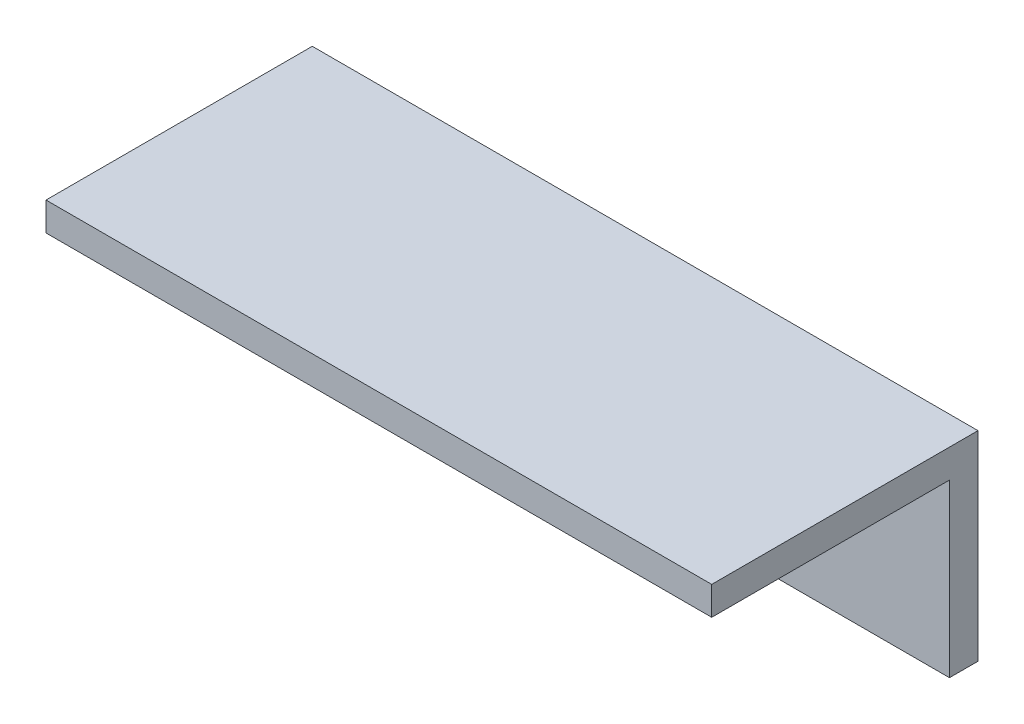
ISO-10303-21;
HEADER;
FILE_DESCRIPTION(('STEP AP214'),'2;1');
FILE_NAME('part.step','',(''),(''),'','','');
FILE_SCHEMA(('AUTOMOTIVE_DESIGN { 1 0 10303 214 1 1 1 1 }'));
ENDSEC;
DATA;
#1=APPLICATION_CONTEXT('core data for automotive mechanical design processes');
#2=APPLICATION_PROTOCOL_DEFINITION('international standard','automotive_design',2000,#1);
#3=PRODUCT_CONTEXT('',#1,'mechanical');
#4=PRODUCT('Part','Part','',(#3));
#5=PRODUCT_RELATED_PRODUCT_CATEGORY('part','',(#4));
#6=PRODUCT_DEFINITION_FORMATION('','',#4);
#7=PRODUCT_DEFINITION_CONTEXT('part definition',#1,'design');
#8=PRODUCT_DEFINITION('design','',#6,#7);
#9=PRODUCT_DEFINITION_SHAPE('','',#8);
#10=(LENGTH_UNIT() NAMED_UNIT(*) SI_UNIT(.MILLI.,.METRE.));
#11=(NAMED_UNIT(*) PLANE_ANGLE_UNIT() SI_UNIT($,.RADIAN.));
#12=(NAMED_UNIT(*) SI_UNIT($,.STERADIAN.) SOLID_ANGLE_UNIT());
#13=UNCERTAINTY_MEASURE_WITH_UNIT(LENGTH_MEASURE(1.E-05),#10,'distance_accuracy_value','');
#14=(GEOMETRIC_REPRESENTATION_CONTEXT(3) GLOBAL_UNCERTAINTY_ASSIGNED_CONTEXT((#13)) GLOBAL_UNIT_ASSIGNED_CONTEXT((#10,
#11,#12)) REPRESENTATION_CONTEXT('',''));
#15=CARTESIAN_POINT('',(0.,0.,0.));
#16=DIRECTION('',(0.,0.,1.));
#17=DIRECTION('',(1.,0.,0.));
#18=AXIS2_PLACEMENT_3D('',#15,#16,#17);
#19=CARTESIAN_POINT('',(0.,0.,0.));
#20=DIRECTION('',(0.,1.,0.));
#21=DIRECTION('',(0.,0.,1.));
#22=AXIS2_PLACEMENT_3D('',#19,#20,#21);
#23=PLANE('',#22);
#24=DIRECTION('',(-1.,0.,0.));
#25=VECTOR('',#24,1.);
#26=CARTESIAN_POINT('',(0.,0.,-65.));
#27=LINE('',#26,#25);
#28=CARTESIAN_POINT('',(350.,0.,-65.));
#29=VERTEX_POINT('',#28);
#30=CARTESIAN_POINT('',(0.,0.,-65.));
#31=VERTEX_POINT('',#30);
#32=EDGE_CURVE('E59',#29,#31,#27,.T.);
#33=ORIENTED_EDGE('',*,*,#32,.F.);
#34=DIRECTION('',(0.,0.,-1.));
#35=VECTOR('',#34,1.);
#36=CARTESIAN_POINT('',(350.,0.,0.));
#37=LINE('',#36,#35);
#38=CARTESIAN_POINT('',(350.,0.,60.));
#39=VERTEX_POINT('',#38);
#40=EDGE_CURVE('E86',#39,#29,#37,.T.);
#41=ORIENTED_EDGE('',*,*,#40,.F.);
#42=DIRECTION('',(1.,0.,0.));
#43=VECTOR('',#42,1.);
#44=CARTESIAN_POINT('',(0.,0.,60.));
#45=LINE('',#44,#43);
#46=CARTESIAN_POINT('',(0.,0.,60.));
#47=VERTEX_POINT('',#46);
#48=EDGE_CURVE('E80',#47,#39,#45,.T.);
#49=ORIENTED_EDGE('',*,*,#48,.F.);
#50=DIRECTION('',(0.,0.,1.));
#51=VECTOR('',#50,1.);
#52=CARTESIAN_POINT('',(0.,0.,0.));
#53=LINE('',#52,#51);
#54=EDGE_CURVE('E87',#31,#47,#53,.T.);
#55=ORIENTED_EDGE('',*,*,#54,.F.);
#56=EDGE_LOOP('',(#33,#41,#49,#55));
#57=FACE_BOUND('',#56,.T.);
#58=ADVANCED_FACE('F43',(#57),#23,.F.);
#59=CARTESIAN_POINT('',(0.,15.,0.));
#60=DIRECTION('',(1.,0.,0.));
#61=DIRECTION('',(0.,0.,-1.));
#62=AXIS2_PLACEMENT_3D('',#59,#60,#61);
#63=PLANE('',#62);
#64=DIRECTION('',(0.,1.,0.));
#65=VECTOR('',#64,1.);
#66=CARTESIAN_POINT('',(0.,15.,-80.));
#67=LINE('',#66,#65);
#68=CARTESIAN_POINT('',(0.,-90.,-80.));
#69=VERTEX_POINT('',#68);
#70=CARTESIAN_POINT('',(0.,15.,-80.));
#71=VERTEX_POINT('',#70);
#72=EDGE_CURVE('E112',#69,#71,#67,.T.);
#73=ORIENTED_EDGE('',*,*,#72,.F.);
#74=DIRECTION('',(0.,0.,-1.));
#75=VECTOR('',#74,1.);
#76=CARTESIAN_POINT('',(0.,-90.,-65.));
#77=LINE('',#76,#75);
#78=CARTESIAN_POINT('',(0.,-90.,-65.));
#79=VERTEX_POINT('',#78);
#80=EDGE_CURVE('E130',#79,#69,#77,.T.);
#81=ORIENTED_EDGE('',*,*,#80,.F.);
#82=DIRECTION('',(0.,1.,0.));
#83=VECTOR('',#82,1.);
#84=CARTESIAN_POINT('',(0.,-90.,-65.));
#85=LINE('',#84,#83);
#86=EDGE_CURVE('E123',#79,#31,#85,.T.);
#87=ORIENTED_EDGE('',*,*,#86,.T.);
#88=ORIENTED_EDGE('',*,*,#54,.T.);
#89=DIRECTION('',(0.,-1.,0.));
#90=VECTOR('',#89,1.);
#91=CARTESIAN_POINT('',(0.,15.,60.));
#92=LINE('',#91,#90);
#93=CARTESIAN_POINT('',(0.,15.,60.));
#94=VERTEX_POINT('',#93);
#95=EDGE_CURVE('E11',#94,#47,#92,.T.);
#96=ORIENTED_EDGE('',*,*,#95,.F.);
#97=DIRECTION('',(0.,0.,1.));
#98=VECTOR('',#97,1.);
#99=CARTESIAN_POINT('',(0.,15.,0.));
#100=LINE('',#99,#98);
#101=EDGE_CURVE('E97',#71,#94,#100,.T.);
#102=ORIENTED_EDGE('',*,*,#101,.F.);
#103=EDGE_LOOP('',(#73,#81,#87,#88,#96,#102));
#104=FACE_BOUND('',#103,.T.);
#105=ADVANCED_FACE('F45',(#104),#63,.F.);
#106=CARTESIAN_POINT('',(0.,15.,60.));
#107=DIRECTION('',(0.,0.,-1.));
#108=DIRECTION('',(-1.,0.,0.));
#109=AXIS2_PLACEMENT_3D('',#106,#107,#108);
#110=PLANE('',#109);
#111=ORIENTED_EDGE('',*,*,#48,.T.);
#112=DIRECTION('',(0.,-1.,0.));
#113=VECTOR('',#112,1.);
#114=CARTESIAN_POINT('',(350.,15.,60.));
#115=LINE('',#114,#113);
#116=CARTESIAN_POINT('',(350.,15.,60.));
#117=VERTEX_POINT('',#116);
#118=EDGE_CURVE('E52',#117,#39,#115,.T.);
#119=ORIENTED_EDGE('',*,*,#118,.F.);
#120=DIRECTION('',(1.,0.,0.));
#121=VECTOR('',#120,1.);
#122=CARTESIAN_POINT('',(0.,15.,60.));
#123=LINE('',#122,#121);
#124=EDGE_CURVE('E68',#94,#117,#123,.T.);
#125=ORIENTED_EDGE('',*,*,#124,.F.);
#126=ORIENTED_EDGE('',*,*,#95,.T.);
#127=EDGE_LOOP('',(#111,#119,#125,#126));
#128=FACE_BOUND('',#127,.T.);
#129=ADVANCED_FACE('F82',(#128),#110,.F.);
#130=CARTESIAN_POINT('',(350.,15.,0.));
#131=DIRECTION('',(-1.,0.,0.));
#132=DIRECTION('',(0.,0.,1.));
#133=AXIS2_PLACEMENT_3D('',#130,#131,#132);
#134=PLANE('',#133);
#135=ORIENTED_EDGE('',*,*,#40,.T.);
#136=DIRECTION('',(0.,1.,0.));
#137=VECTOR('',#136,1.);
#138=CARTESIAN_POINT('',(350.,-90.,-65.));
#139=LINE('',#138,#137);
#140=CARTESIAN_POINT('',(350.,-90.,-65.));
#141=VERTEX_POINT('',#140);
#142=EDGE_CURVE('E120',#141,#29,#139,.T.);
#143=ORIENTED_EDGE('',*,*,#142,.F.);
#144=DIRECTION('',(0.,0.,1.));
#145=VECTOR('',#144,1.);
#146=CARTESIAN_POINT('',(350.,-90.,-65.));
#147=LINE('',#146,#145);
#148=CARTESIAN_POINT('',(350.,-90.,-80.));
#149=VERTEX_POINT('',#148);
#150=EDGE_CURVE('E134',#149,#141,#147,.T.);
#151=ORIENTED_EDGE('',*,*,#150,.F.);
#152=DIRECTION('',(0.,-1.,0.));
#153=VECTOR('',#152,1.);
#154=CARTESIAN_POINT('',(350.,15.,-80.));
#155=LINE('',#154,#153);
#156=CARTESIAN_POINT('',(350.,15.,-80.));
#157=VERTEX_POINT('',#156);
#158=EDGE_CURVE('E116',#157,#149,#155,.T.);
#159=ORIENTED_EDGE('',*,*,#158,.F.);
#160=DIRECTION('',(0.,0.,-1.));
#161=VECTOR('',#160,1.);
#162=CARTESIAN_POINT('',(350.,15.,0.));
#163=LINE('',#162,#161);
#164=EDGE_CURVE('E94',#117,#157,#163,.T.);
#165=ORIENTED_EDGE('',*,*,#164,.F.);
#166=ORIENTED_EDGE('',*,*,#118,.T.);
#167=EDGE_LOOP('',(#135,#143,#151,#159,#165,#166));
#168=FACE_BOUND('',#167,.T.);
#169=ADVANCED_FACE('F90',(#168),#134,.F.);
#170=CARTESIAN_POINT('',(0.,15.,0.));
#171=DIRECTION('',(0.,1.,0.));
#172=DIRECTION('',(0.,0.,1.));
#173=AXIS2_PLACEMENT_3D('',#170,#171,#172);
#174=PLANE('',#173);
#175=ORIENTED_EDGE('',*,*,#101,.T.);
#176=ORIENTED_EDGE('',*,*,#124,.T.);
#177=ORIENTED_EDGE('',*,*,#164,.T.);
#178=DIRECTION('',(1.,0.,0.));
#179=VECTOR('',#178,1.);
#180=CARTESIAN_POINT('',(350.,15.,-80.));
#181=LINE('',#180,#179);
#182=EDGE_CURVE('E104',#71,#157,#181,.T.);
#183=ORIENTED_EDGE('',*,*,#182,.F.);
#184=EDGE_LOOP('',(#175,#176,#177,#183));
#185=FACE_BOUND('',#184,.T.);
#186=ADVANCED_FACE('F167',(#185),#174,.T.);
#187=CARTESIAN_POINT('',(0.,0.,-80.));
#188=DIRECTION('',(0.,0.,-1.));
#189=DIRECTION('',(-1.,0.,0.));
#190=AXIS2_PLACEMENT_3D('',#187,#188,#189);
#191=PLANE('',#190);
#192=ORIENTED_EDGE('',*,*,#158,.T.);
#193=DIRECTION('',(1.,0.,0.));
#194=VECTOR('',#193,1.);
#195=CARTESIAN_POINT('',(0.,-90.,-80.));
#196=LINE('',#195,#194);
#197=EDGE_CURVE('E138',#69,#149,#196,.T.);
#198=ORIENTED_EDGE('',*,*,#197,.F.);
#199=ORIENTED_EDGE('',*,*,#72,.T.);
#200=ORIENTED_EDGE('',*,*,#182,.T.);
#201=EDGE_LOOP('',(#192,#198,#199,#200));
#202=FACE_BOUND('',#201,.T.);
#203=ADVANCED_FACE('F169',(#202),#191,.T.);
#204=CARTESIAN_POINT('',(0.,-90.,-65.));
#205=DIRECTION('',(0.,0.,-1.));
#206=DIRECTION('',(-1.,0.,0.));
#207=AXIS2_PLACEMENT_3D('',#204,#205,#206);
#208=PLANE('',#207);
#209=ORIENTED_EDGE('',*,*,#32,.T.);
#210=ORIENTED_EDGE('',*,*,#86,.F.);
#211=DIRECTION('',(-1.,0.,0.));
#212=VECTOR('',#211,1.);
#213=CARTESIAN_POINT('',(0.,-90.,-65.));
#214=LINE('',#213,#212);
#215=EDGE_CURVE('E127',#141,#79,#214,.T.);
#216=ORIENTED_EDGE('',*,*,#215,.F.);
#217=ORIENTED_EDGE('',*,*,#142,.T.);
#218=EDGE_LOOP('',(#209,#210,#216,#217));
#219=FACE_BOUND('',#218,.T.);
#220=ADVANCED_FACE('F171',(#219),#208,.F.);
#221=CARTESIAN_POINT('',(0.,-90.,0.));
#222=DIRECTION('',(0.,-1.,0.));
#223=DIRECTION('',(0.,0.,-1.));
#224=AXIS2_PLACEMENT_3D('',#221,#222,#223);
#225=PLANE('',#224);
#226=ORIENTED_EDGE('',*,*,#80,.T.);
#227=ORIENTED_EDGE('',*,*,#197,.T.);
#228=ORIENTED_EDGE('',*,*,#150,.T.);
#229=ORIENTED_EDGE('',*,*,#215,.T.);
#230=EDGE_LOOP('',(#226,#227,#228,#229));
#231=FACE_BOUND('',#230,.T.);
#232=ADVANCED_FACE('F147',(#231),#225,.T.);
#233=CLOSED_SHELL('',(#58,#105,#129,#169,#186,#203,#220,#232));
#234=MANIFOLD_SOLID_BREP('B2',#233);
#235=ADVANCED_BREP_SHAPE_REPRESENTATION('',(#18,#234),#14);
#236=SHAPE_DEFINITION_REPRESENTATION(#9,#235);
ENDSEC;
END-ISO-10303-21;
